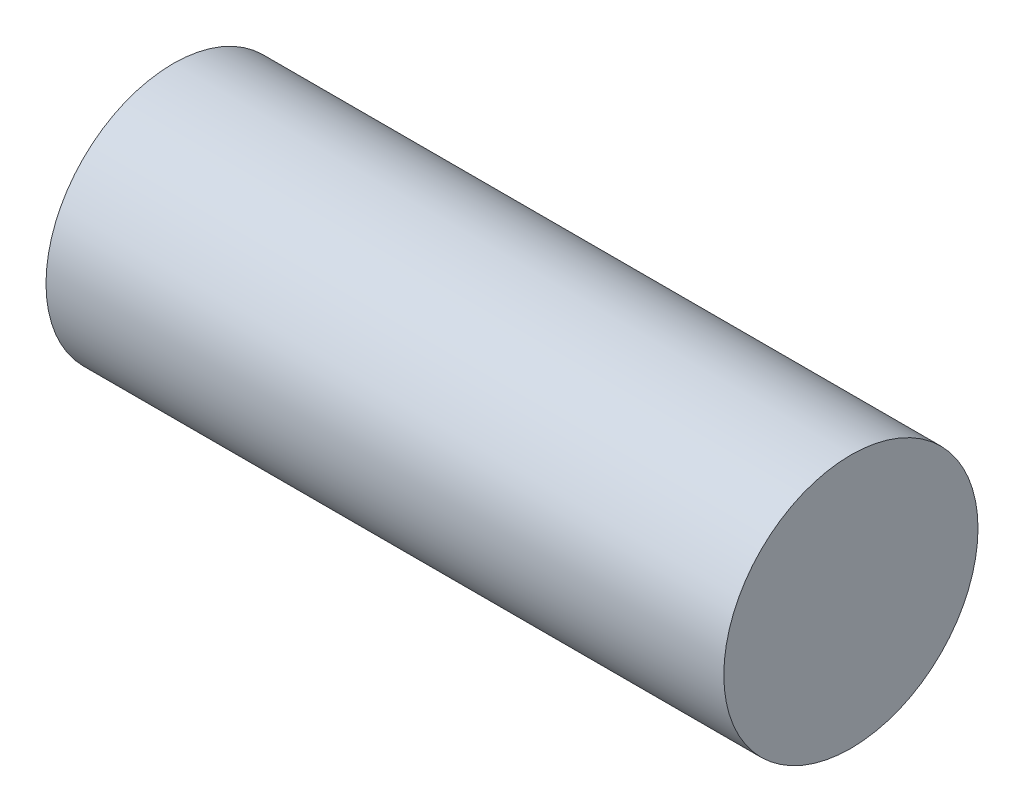
ISO-10303-21;
HEADER;
FILE_DESCRIPTION(('STEP AP214'),'2;1');
FILE_NAME('part.step','',(''),(''),'','','');
FILE_SCHEMA(('AUTOMOTIVE_DESIGN { 1 0 10303 214 1 1 1 1 }'));
ENDSEC;
DATA;
#1=APPLICATION_CONTEXT('core data for automotive mechanical design processes');
#2=APPLICATION_PROTOCOL_DEFINITION('international standard','automotive_design',2000,#1);
#3=PRODUCT_CONTEXT('',#1,'mechanical');
#4=PRODUCT('Part','Part','',(#3));
#5=PRODUCT_RELATED_PRODUCT_CATEGORY('part','',(#4));
#6=PRODUCT_DEFINITION_FORMATION('','',#4);
#7=PRODUCT_DEFINITION_CONTEXT('part definition',#1,'design');
#8=PRODUCT_DEFINITION('design','',#6,#7);
#9=PRODUCT_DEFINITION_SHAPE('','',#8);
#10=(LENGTH_UNIT() NAMED_UNIT(*) SI_UNIT(.MILLI.,.METRE.));
#11=(NAMED_UNIT(*) PLANE_ANGLE_UNIT() SI_UNIT($,.RADIAN.));
#12=(NAMED_UNIT(*) SI_UNIT($,.STERADIAN.) SOLID_ANGLE_UNIT());
#13=UNCERTAINTY_MEASURE_WITH_UNIT(LENGTH_MEASURE(1.E-05),#10,'distance_accuracy_value','');
#14=(GEOMETRIC_REPRESENTATION_CONTEXT(3) GLOBAL_UNCERTAINTY_ASSIGNED_CONTEXT((#13)) GLOBAL_UNIT_ASSIGNED_CONTEXT((#10,
#11,#12)) REPRESENTATION_CONTEXT('',''));
#15=CARTESIAN_POINT('',(0.,0.,0.));
#16=DIRECTION('',(0.,0.,1.));
#17=DIRECTION('',(1.,0.,0.));
#18=AXIS2_PLACEMENT_3D('',#15,#16,#17);
#19=CARTESIAN_POINT('',(4.,0.,0.));
#20=DIRECTION('',(-1.,0.,0.));
#21=DIRECTION('',(0.,0.,1.));
#22=AXIS2_PLACEMENT_3D('',#19,#20,#21);
#23=CYLINDRICAL_SURFACE('',#22,0.75);
#24=CARTESIAN_POINT('',(4.,0.,0.));
#25=DIRECTION('',(1.,0.,0.));
#26=DIRECTION('',(0.,0.,-1.));
#27=AXIS2_PLACEMENT_3D('',#24,#25,#26);
#28=CIRCLE('',#27,0.75);
#29=CARTESIAN_POINT('',(4.,0.,-0.75));
#30=VERTEX_POINT('',#29);
#31=EDGE_CURVE('E10',#30,#30,#28,.T.);
#32=ORIENTED_EDGE('',*,*,#31,.F.);
#33=EDGE_LOOP('',(#32));
#34=FACE_BOUND('',#33,.T.);
#35=CARTESIAN_POINT('',(0.,0.,0.));
#36=DIRECTION('',(1.,0.,0.));
#37=DIRECTION('',(0.,0.,-1.));
#38=AXIS2_PLACEMENT_3D('',#35,#36,#37);
#39=CIRCLE('',#38,0.75);
#40=CARTESIAN_POINT('',(0.,0.,-0.75));
#41=VERTEX_POINT('',#40);
#42=EDGE_CURVE('E34',#41,#41,#39,.T.);
#43=ORIENTED_EDGE('',*,*,#42,.T.);
#44=EDGE_LOOP('',(#43));
#45=FACE_BOUND('',#44,.T.);
#46=ADVANCED_FACE('F31',(#34,#45),#23,.T.);
#47=CARTESIAN_POINT('',(4.,0.,0.));
#48=DIRECTION('',(1.,0.,0.));
#49=DIRECTION('',(0.,0.,-1.));
#50=AXIS2_PLACEMENT_3D('',#47,#48,#49);
#51=PLANE('',#50);
#52=ORIENTED_EDGE('',*,*,#31,.T.);
#53=EDGE_LOOP('',(#52));
#54=FACE_BOUND('',#53,.T.);
#55=ADVANCED_FACE('F46',(#54),#51,.T.);
#56=CARTESIAN_POINT('',(0.,0.,0.));
#57=DIRECTION('',(1.,0.,0.));
#58=DIRECTION('',(0.,0.,-1.));
#59=AXIS2_PLACEMENT_3D('',#56,#57,#58);
#60=PLANE('',#59);
#61=ORIENTED_EDGE('',*,*,#42,.F.);
#62=EDGE_LOOP('',(#61));
#63=FACE_BOUND('',#62,.T.);
#64=ADVANCED_FACE('F44',(#63),#60,.F.);
#65=CLOSED_SHELL('',(#46,#55,#64));
#66=MANIFOLD_SOLID_BREP('B2',#65);
#67=ADVANCED_BREP_SHAPE_REPRESENTATION('',(#18,#66),#14);
#68=SHAPE_DEFINITION_REPRESENTATION(#9,#67);
ENDSEC;
END-ISO-10303-21;
